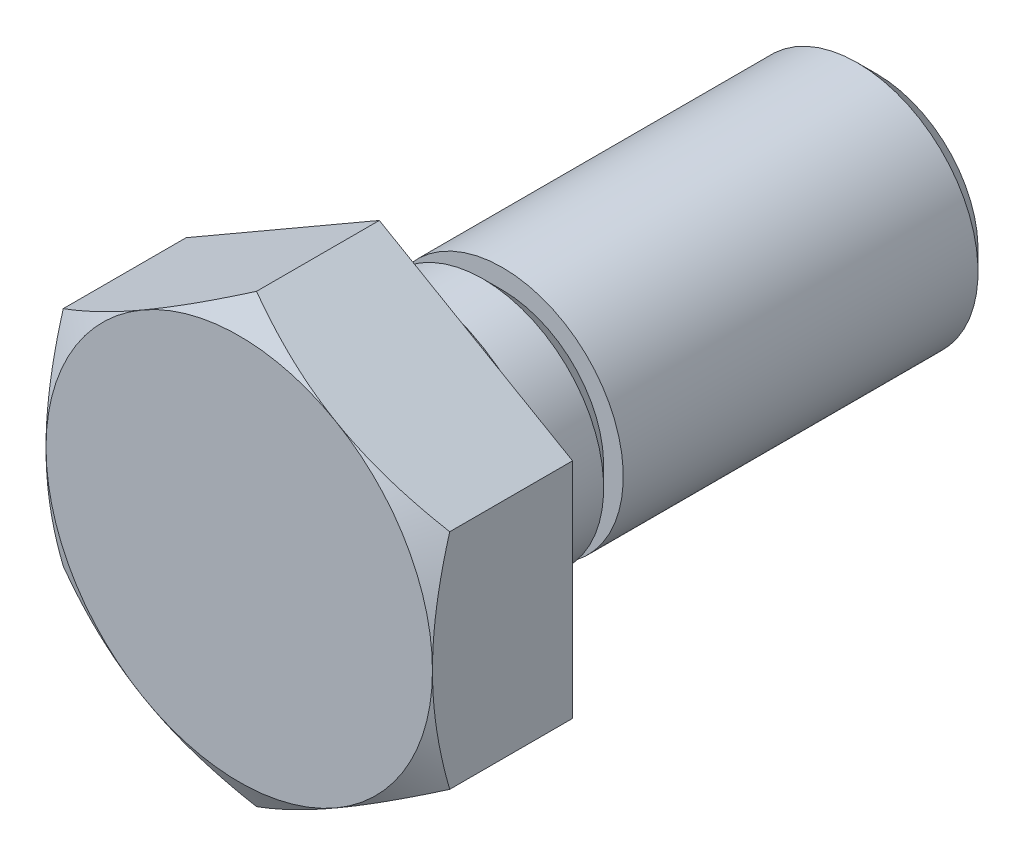
ISO-10303-21;
HEADER;
FILE_DESCRIPTION(('STEP AP214'),'2;1');
FILE_NAME('part.step','',(''),(''),'','','');
FILE_SCHEMA(('AUTOMOTIVE_DESIGN { 1 0 10303 214 1 1 1 1 }'));
ENDSEC;
DATA;
#1=APPLICATION_CONTEXT('core data for automotive mechanical design processes');
#2=APPLICATION_PROTOCOL_DEFINITION('international standard','automotive_design',2000,#1);
#3=PRODUCT_CONTEXT('',#1,'mechanical');
#4=PRODUCT('Part','Part','',(#3));
#5=PRODUCT_RELATED_PRODUCT_CATEGORY('part','',(#4));
#6=PRODUCT_DEFINITION_FORMATION('','',#4);
#7=PRODUCT_DEFINITION_CONTEXT('part definition',#1,'design');
#8=PRODUCT_DEFINITION('design','',#6,#7);
#9=PRODUCT_DEFINITION_SHAPE('','',#8);
#10=(LENGTH_UNIT() NAMED_UNIT(*) SI_UNIT(.MILLI.,.METRE.));
#11=(NAMED_UNIT(*) PLANE_ANGLE_UNIT() SI_UNIT($,.RADIAN.));
#12=(NAMED_UNIT(*) SI_UNIT($,.STERADIAN.) SOLID_ANGLE_UNIT());
#13=UNCERTAINTY_MEASURE_WITH_UNIT(LENGTH_MEASURE(1.E-05),#10,'distance_accuracy_value','');
#14=(GEOMETRIC_REPRESENTATION_CONTEXT(3) GLOBAL_UNCERTAINTY_ASSIGNED_CONTEXT((#13)) GLOBAL_UNIT_ASSIGNED_CONTEXT((#10,
#11,#12)) REPRESENTATION_CONTEXT('',''));
#15=CARTESIAN_POINT('',(0.,0.,0.));
#16=DIRECTION('',(0.,0.,1.));
#17=DIRECTION('',(1.,0.,0.));
#18=AXIS2_PLACEMENT_3D('',#15,#16,#17);
#19=CARTESIAN_POINT('',(0.,4.,6.4));
#20=DIRECTION('',(0.,0.,1.));
#21=DIRECTION('',(0.,-1.,0.));
#22=AXIS2_PLACEMENT_3D('',#19,#20,#21);
#23=PLANE('',#22);
#24=CARTESIAN_POINT('',(0.,0.,6.4));
#25=DIRECTION('',(0.,0.,-1.));
#26=DIRECTION('',(0.,1.,0.));
#27=AXIS2_PLACEMENT_3D('',#24,#25,#26);
#28=CIRCLE('',#27,8.);
#29=CARTESIAN_POINT('',(-4.,6.92820323027551,6.4));
#30=VERTEX_POINT('',#29);
#31=CARTESIAN_POINT('',(4.,6.92820323027551,6.4));
#32=VERTEX_POINT('',#31);
#33=EDGE_CURVE('E153',#30,#32,#28,.T.);
#34=ORIENTED_EDGE('',*,*,#33,.F.);
#35=CARTESIAN_POINT('',(0.,0.,6.4));
#36=DIRECTION('',(0.,0.,-1.));
#37=DIRECTION('',(0.,1.,0.));
#38=AXIS2_PLACEMENT_3D('',#35,#36,#37);
#39=CIRCLE('',#38,8.);
#40=CARTESIAN_POINT('',(-8.,0.,6.4));
#41=VERTEX_POINT('',#40);
#42=EDGE_CURVE('E172',#41,#30,#39,.T.);
#43=ORIENTED_EDGE('',*,*,#42,.F.);
#44=CARTESIAN_POINT('',(0.,0.,6.4));
#45=DIRECTION('',(0.,0.,-1.));
#46=DIRECTION('',(0.,1.,0.));
#47=AXIS2_PLACEMENT_3D('',#44,#45,#46);
#48=CIRCLE('',#47,8.);
#49=CARTESIAN_POINT('',(-4.,-6.92820323027551,6.4));
#50=VERTEX_POINT('',#49);
#51=EDGE_CURVE('E221',#50,#41,#48,.T.);
#52=ORIENTED_EDGE('',*,*,#51,.F.);
#53=CARTESIAN_POINT('',(0.,0.,6.4));
#54=DIRECTION('',(0.,0.,-1.));
#55=DIRECTION('',(0.,1.,0.));
#56=AXIS2_PLACEMENT_3D('',#53,#54,#55);
#57=CIRCLE('',#56,8.);
#58=CARTESIAN_POINT('',(4.,-6.92820323027551,6.4));
#59=VERTEX_POINT('',#58);
#60=EDGE_CURVE('E274',#59,#50,#57,.T.);
#61=ORIENTED_EDGE('',*,*,#60,.F.);
#62=CARTESIAN_POINT('',(0.,0.,6.4));
#63=DIRECTION('',(0.,0.,-1.));
#64=DIRECTION('',(0.,1.,0.));
#65=AXIS2_PLACEMENT_3D('',#62,#63,#64);
#66=CIRCLE('',#65,8.);
#67=CARTESIAN_POINT('',(8.,0.,6.4));
#68=VERTEX_POINT('',#67);
#69=EDGE_CURVE('E272',#68,#59,#66,.T.);
#70=ORIENTED_EDGE('',*,*,#69,.F.);
#71=CARTESIAN_POINT('',(0.,0.,6.4));
#72=DIRECTION('',(0.,0.,-1.));
#73=DIRECTION('',(0.,1.,0.));
#74=AXIS2_PLACEMENT_3D('',#71,#72,#73);
#75=CIRCLE('',#74,8.);
#76=EDGE_CURVE('E222',#32,#68,#75,.T.);
#77=ORIENTED_EDGE('',*,*,#76,.F.);
#78=EDGE_LOOP('',(#34,#43,#52,#61,#70,#77));
#79=FACE_BOUND('',#78,.T.);
#80=ADVANCED_FACE('F16',(#79),#23,.T.);
#81=CARTESIAN_POINT('',(0.,2.0940625,-20.));
#82=DIRECTION('',(0.,0.,-1.));
#83=DIRECTION('',(0.,1.,0.));
#84=AXIS2_PLACEMENT_3D('',#81,#82,#83);
#85=PLANE('',#84);
#86=CARTESIAN_POINT('',(0.,0.,-20.));
#87=DIRECTION('',(0.,0.,-1.));
#88=DIRECTION('',(0.,1.,0.));
#89=AXIS2_PLACEMENT_3D('',#86,#87,#88);
#90=CIRCLE('',#89,4.188125);
#91=CARTESIAN_POINT('',(0.,4.188125,-20.));
#92=VERTEX_POINT('',#91);
#93=EDGE_CURVE('E11',#92,#92,#90,.T.);
#94=ORIENTED_EDGE('',*,*,#93,.T.);
#95=EDGE_LOOP('',(#94));
#96=FACE_BOUND('',#95,.T.);
#97=ADVANCED_FACE('F381',(#96),#85,.T.);
#98=CARTESIAN_POINT('',(0.,0.,-19.5940625));
#99=DIRECTION('',(0.,0.,1.));
#100=DIRECTION('',(0.,1.,0.));
#101=AXIS2_PLACEMENT_3D('',#98,#99,#100);
#102=CONICAL_SURFACE('',#101,4.5940625,0.785398163397448);
#103=CARTESIAN_POINT('',(0.,0.,-19.188125));
#104=DIRECTION('',(0.,0.,-1.));
#105=DIRECTION('',(0.,1.,0.));
#106=AXIS2_PLACEMENT_3D('',#103,#104,#105);
#107=CIRCLE('',#106,5.);
#108=CARTESIAN_POINT('',(0.,5.,-19.188125));
#109=VERTEX_POINT('',#108);
#110=EDGE_CURVE('E28',#109,#109,#107,.T.);
#111=ORIENTED_EDGE('',*,*,#110,.T.);
#112=EDGE_LOOP('',(#111));
#113=FACE_BOUND('',#112,.T.);
#114=ORIENTED_EDGE('',*,*,#93,.F.);
#115=EDGE_LOOP('',(#114));
#116=FACE_BOUND('',#115,.T.);
#117=ADVANCED_FACE('F18',(#113,#116),#102,.T.);
#118=CARTESIAN_POINT('',(0.,0.,-11.8440625));
#119=DIRECTION('',(0.,0.,1.));
#120=DIRECTION('',(0.,1.,0.));
#121=AXIS2_PLACEMENT_3D('',#118,#119,#120);
#122=CYLINDRICAL_SURFACE('',#121,5.);
#123=CARTESIAN_POINT('',(0.,0.,-4.5));
#124=DIRECTION('',(0.,0.,-1.));
#125=DIRECTION('',(0.,1.,0.));
#126=AXIS2_PLACEMENT_3D('',#123,#124,#125);
#127=CIRCLE('',#126,5.);
#128=CARTESIAN_POINT('',(0.,5.,-4.5));
#129=VERTEX_POINT('',#128);
#130=EDGE_CURVE('E171',#129,#129,#127,.T.);
#131=ORIENTED_EDGE('',*,*,#130,.T.);
#132=EDGE_LOOP('',(#131));
#133=FACE_BOUND('',#132,.T.);
#134=ORIENTED_EDGE('',*,*,#110,.F.);
#135=EDGE_LOOP('',(#134));
#136=FACE_BOUND('',#135,.T.);
#137=ADVANCED_FACE('F368',(#133,#136),#122,.T.);
#138=CARTESIAN_POINT('',(0.,4.5940625,-4.5));
#139=DIRECTION('',(0.,0.,1.));
#140=DIRECTION('',(0.,-1.,0.));
#141=AXIS2_PLACEMENT_3D('',#138,#139,#140);
#142=PLANE('',#141);
#143=CARTESIAN_POINT('',(0.,0.,-4.5));
#144=DIRECTION('',(0.,0.,-1.));
#145=DIRECTION('',(0.,1.,0.));
#146=AXIS2_PLACEMENT_3D('',#143,#144,#145);
#147=CIRCLE('',#146,4.188125);
#148=CARTESIAN_POINT('',(0.,4.188125,-4.5));
#149=VERTEX_POINT('',#148);
#150=EDGE_CURVE('E147',#149,#149,#147,.T.);
#151=ORIENTED_EDGE('',*,*,#150,.T.);
#152=EDGE_LOOP('',(#151));
#153=FACE_BOUND('',#152,.T.);
#154=ORIENTED_EDGE('',*,*,#130,.F.);
#155=EDGE_LOOP('',(#154));
#156=FACE_BOUND('',#155,.T.);
#157=ADVANCED_FACE('F370',(#153,#156),#142,.T.);
#158=CARTESIAN_POINT('',(0.,0.,-4.0940625));
#159=DIRECTION('',(0.,0.,1.));
#160=DIRECTION('',(0.,1.,0.));
#161=AXIS2_PLACEMENT_3D('',#158,#159,#160);
#162=CONICAL_SURFACE('',#161,4.5940625,0.785398163397449);
#163=CARTESIAN_POINT('',(0.,0.,-3.688125));
#164=DIRECTION('',(0.,0.,-1.));
#165=DIRECTION('',(0.,1.,0.));
#166=AXIS2_PLACEMENT_3D('',#163,#164,#165);
#167=CIRCLE('',#166,5.);
#168=CARTESIAN_POINT('',(0.,5.,-3.688125));
#169=VERTEX_POINT('',#168);
#170=EDGE_CURVE('E145',#169,#169,#167,.T.);
#171=ORIENTED_EDGE('',*,*,#170,.T.);
#172=EDGE_LOOP('',(#171));
#173=FACE_BOUND('',#172,.T.);
#174=ORIENTED_EDGE('',*,*,#150,.F.);
#175=EDGE_LOOP('',(#174));
#176=FACE_BOUND('',#175,.T.);
#177=ADVANCED_FACE('F378',(#173,#176),#162,.T.);
#178=CARTESIAN_POINT('',(0.,0.,-2.0440625));
#179=DIRECTION('',(0.,0.,1.));
#180=DIRECTION('',(0.,1.,0.));
#181=AXIS2_PLACEMENT_3D('',#178,#179,#180);
#182=CYLINDRICAL_SURFACE('',#181,5.);
#183=CARTESIAN_POINT('',(0.,0.,-0.4));
#184=DIRECTION('',(0.,0.,-1.));
#185=DIRECTION('',(0.,1.,0.));
#186=AXIS2_PLACEMENT_3D('',#183,#184,#185);
#187=CIRCLE('',#186,5.);
#188=CARTESIAN_POINT('',(0.,5.,-0.4));
#189=VERTEX_POINT('',#188);
#190=EDGE_CURVE('E141',#189,#189,#187,.T.);
#191=ORIENTED_EDGE('',*,*,#190,.T.);
#192=EDGE_LOOP('',(#191));
#193=FACE_BOUND('',#192,.T.);
#194=ORIENTED_EDGE('',*,*,#170,.F.);
#195=EDGE_LOOP('',(#194));
#196=FACE_BOUND('',#195,.T.);
#197=ADVANCED_FACE('F142',(#193,#196),#182,.T.);
#198=CARTESIAN_POINT('',(0.,0.,-0.4));
#199=DIRECTION('',(0.,0.,-1.));
#200=DIRECTION('',(-1.,0.,0.));
#201=AXIS2_PLACEMENT_3D('',#198,#199,#200);
#202=TOROIDAL_SURFACE('',#201,5.4,0.4);
#203=CARTESIAN_POINT('',(0.,0.,0.));
#204=DIRECTION('',(0.,0.,-1.));
#205=DIRECTION('',(0.,1.,0.));
#206=AXIS2_PLACEMENT_3D('',#203,#204,#205);
#207=CIRCLE('',#206,5.4);
#208=CARTESIAN_POINT('',(0.,5.4,0.));
#209=VERTEX_POINT('',#208);
#210=EDGE_CURVE('E137',#209,#209,#207,.T.);
#211=ORIENTED_EDGE('',*,*,#210,.T.);
#212=EDGE_LOOP('',(#211));
#213=FACE_BOUND('',#212,.T.);
#214=ORIENTED_EDGE('',*,*,#190,.F.);
#215=EDGE_LOOP('',(#214));
#216=FACE_BOUND('',#215,.T.);
#217=ADVANCED_FACE('F405',(#213,#216),#202,.F.);
#218=CARTESIAN_POINT('',(0.,6.3075,0.));
#219=DIRECTION('',(0.,0.,-1.));
#220=DIRECTION('',(0.,1.,0.));
#221=AXIS2_PLACEMENT_3D('',#218,#219,#220);
#222=PLANE('',#221);
#223=CARTESIAN_POINT('',(0.,0.,0.));
#224=DIRECTION('',(0.,0.,-1.));
#225=DIRECTION('',(0.,1.,0.));
#226=AXIS2_PLACEMENT_3D('',#223,#224,#225);
#227=CIRCLE('',#226,7.215);
#228=CARTESIAN_POINT('',(0.,7.215,0.));
#229=VERTEX_POINT('',#228);
#230=EDGE_CURVE('E149',#229,#229,#227,.T.);
#231=ORIENTED_EDGE('',*,*,#230,.T.);
#232=EDGE_LOOP('',(#231));
#233=FACE_BOUND('',#232,.T.);
#234=ORIENTED_EDGE('',*,*,#210,.F.);
#235=EDGE_LOOP('',(#234));
#236=FACE_BOUND('',#235,.T.);
#237=ADVANCED_FACE('F401',(#233,#236),#222,.T.);
#238=CARTESIAN_POINT('',(0.,0.,0.1));
#239=DIRECTION('',(0.,0.,-1.));
#240=DIRECTION('',(-1.,0.,0.));
#241=AXIS2_PLACEMENT_3D('',#238,#239,#240);
#242=TOROIDAL_SURFACE('',#241,7.215,0.1);
#243=CARTESIAN_POINT('',(0.,0.,0.1));
#244=DIRECTION('',(0.,0.,-1.));
#245=DIRECTION('',(0.,1.,0.));
#246=AXIS2_PLACEMENT_3D('',#243,#244,#245);
#247=CIRCLE('',#246,7.315);
#248=CARTESIAN_POINT('',(0.,7.315,0.1));
#249=VERTEX_POINT('',#248);
#250=EDGE_CURVE('E354',#249,#249,#247,.T.);
#251=ORIENTED_EDGE('',*,*,#250,.T.);
#252=EDGE_LOOP('',(#251));
#253=FACE_BOUND('',#252,.T.);
#254=ORIENTED_EDGE('',*,*,#230,.F.);
#255=EDGE_LOOP('',(#254));
#256=FACE_BOUND('',#255,.T.);
#257=ADVANCED_FACE('F404',(#253,#256),#242,.T.);
#258=CARTESIAN_POINT('',(0.,0.,0.2));
#259=DIRECTION('',(0.,0.,1.));
#260=DIRECTION('',(0.,1.,0.));
#261=AXIS2_PLACEMENT_3D('',#258,#259,#260);
#262=CYLINDRICAL_SURFACE('',#261,7.315);
#263=CARTESIAN_POINT('',(0.,0.,0.3));
#264=DIRECTION('',(0.,0.,-1.));
#265=DIRECTION('',(0.,1.,0.));
#266=AXIS2_PLACEMENT_3D('',#263,#264,#265);
#267=CIRCLE('',#266,7.315);
#268=CARTESIAN_POINT('',(0.,7.315,0.3));
#269=VERTEX_POINT('',#268);
#270=EDGE_CURVE('E236',#269,#269,#267,.T.);
#271=ORIENTED_EDGE('',*,*,#270,.T.);
#272=EDGE_LOOP('',(#271));
#273=FACE_BOUND('',#272,.T.);
#274=ORIENTED_EDGE('',*,*,#250,.F.);
#275=EDGE_LOOP('',(#274));
#276=FACE_BOUND('',#275,.T.);
#277=ADVANCED_FACE('F424',(#273,#276),#262,.T.);
#278=CARTESIAN_POINT('',(0.,0.,0.3));
#279=DIRECTION('',(0.,0.,-1.));
#280=DIRECTION('',(-1.,0.,0.));
#281=AXIS2_PLACEMENT_3D('',#278,#279,#280);
#282=TOROIDAL_SURFACE('',#281,7.615,0.3);
#283=CARTESIAN_POINT('',(0.,0.,0.6));
#284=DIRECTION('',(0.,0.,-1.));
#285=DIRECTION('',(0.,1.,0.));
#286=AXIS2_PLACEMENT_3D('',#283,#284,#285);
#287=CIRCLE('',#286,7.615);
#288=CARTESIAN_POINT('',(0.,7.615,0.6));
#289=VERTEX_POINT('',#288);
#290=EDGE_CURVE('E233',#289,#289,#287,.T.);
#291=ORIENTED_EDGE('',*,*,#290,.T.);
#292=EDGE_LOOP('',(#291));
#293=FACE_BOUND('',#292,.T.);
#294=ORIENTED_EDGE('',*,*,#270,.F.);
#295=EDGE_LOOP('',(#294));
#296=FACE_BOUND('',#295,.T.);
#297=ADVANCED_FACE('F426',(#293,#296),#282,.F.);
#298=CARTESIAN_POINT('',(0.,8.4263,0.6));
#299=DIRECTION('',(0.,0.,-1.));
#300=DIRECTION('',(0.,1.,0.));
#301=AXIS2_PLACEMENT_3D('',#298,#299,#300);
#302=PLANE('',#301);
#303=ORIENTED_EDGE('',*,*,#290,.F.);
#304=EDGE_LOOP('',(#303));
#305=FACE_BOUND('',#304,.T.);
#306=DIRECTION('',(0.866025403784439,0.5,0.));
#307=VECTOR('',#306,1.);
#308=CARTESIAN_POINT('',(5.82434746497721,-5.87491573027551,0.6));
#309=LINE('',#308,#307);
#310=CARTESIAN_POINT('',(7.46000695697177E-06,-9.23759999999699,0.6));
#311=VERTEX_POINT('',#310);
#312=CARTESIAN_POINT('',(7.99999253999304,-4.61880646055403,0.6));
#313=VERTEX_POINT('',#312);
#314=EDGE_CURVE('E270',#311,#313,#309,.T.);
#315=ORIENTED_EDGE('',*,*,#314,.F.);
#316=CARTESIAN_POINT('',(0.,0.,0.6));
#317=DIRECTION('',(0.,0.,-1.));
#318=DIRECTION('',(0.,1.,0.));
#319=AXIS2_PLACEMENT_3D('',#316,#317,#318);
#320=CIRCLE('',#319,9.2376);
#321=CARTESIAN_POINT('',(-7.46000695315288E-06,-9.23759999999699,0.6));
#322=VERTEX_POINT('',#321);
#323=EDGE_CURVE('E237',#311,#322,#320,.T.);
#324=ORIENTED_EDGE('',*,*,#323,.T.);
#325=DIRECTION('',(0.866025403784439,-0.5,0.));
#326=VECTOR('',#325,1.);
#327=CARTESIAN_POINT('',(-5.8243474649772,-5.87491573027551,0.6));
#328=LINE('',#327,#326);
#329=CARTESIAN_POINT('',(-7.99999253999304,-4.61880646055403,0.6));
#330=VERTEX_POINT('',#329);
#331=EDGE_CURVE('E186',#330,#322,#328,.T.);
#332=ORIENTED_EDGE('',*,*,#331,.F.);
#333=CARTESIAN_POINT('',(0.,0.,0.6));
#334=DIRECTION('',(0.,0.,-1.));
#335=DIRECTION('',(0.,1.,0.));
#336=AXIS2_PLACEMENT_3D('',#333,#334,#335);
#337=CIRCLE('',#336,9.2376);
#338=CARTESIAN_POINT('',(-8.,-4.61879353944296,0.6));
#339=VERTEX_POINT('',#338);
#340=EDGE_CURVE('E242',#330,#339,#337,.T.);
#341=ORIENTED_EDGE('',*,*,#340,.T.);
#342=DIRECTION('',(0.,-1.,0.));
#343=VECTOR('',#342,1.);
#344=CARTESIAN_POINT('',(-8.,4.21315,0.6));
#345=LINE('',#344,#343);
#346=CARTESIAN_POINT('',(-8.,4.61879353944296,0.6));
#347=VERTEX_POINT('',#346);
#348=EDGE_CURVE('E247',#347,#339,#345,.T.);
#349=ORIENTED_EDGE('',*,*,#348,.F.);
#350=CARTESIAN_POINT('',(0.,0.,0.6));
#351=DIRECTION('',(0.,0.,-1.));
#352=DIRECTION('',(0.,1.,0.));
#353=AXIS2_PLACEMENT_3D('',#350,#351,#352);
#354=CIRCLE('',#353,9.2376);
#355=CARTESIAN_POINT('',(-7.99999253999305,4.61880646055402,0.6));
#356=VERTEX_POINT('',#355);
#357=EDGE_CURVE('E155',#347,#356,#354,.T.);
#358=ORIENTED_EDGE('',*,*,#357,.T.);
#359=DIRECTION('',(-0.866025403784439,-0.5,0.));
#360=VECTOR('',#359,1.);
#361=CARTESIAN_POINT('',(-2.1756525350228,7.98149073027551,0.6));
#362=LINE('',#361,#360);
#363=CARTESIAN_POINT('',(-7.46000695714968E-06,9.23759999999699,0.6));
#364=VERTEX_POINT('',#363);
#365=EDGE_CURVE('E176',#364,#356,#362,.T.);
#366=ORIENTED_EDGE('',*,*,#365,.F.);
#367=CARTESIAN_POINT('',(0.,0.,0.6));
#368=DIRECTION('',(0.,0.,-1.));
#369=DIRECTION('',(0.,1.,0.));
#370=AXIS2_PLACEMENT_3D('',#367,#368,#369);
#371=CIRCLE('',#370,9.2376);
#372=CARTESIAN_POINT('',(7.4600069516427E-06,9.23759999999699,0.6));
#373=VERTEX_POINT('',#372);
#374=EDGE_CURVE('E158',#364,#373,#371,.T.);
#375=ORIENTED_EDGE('',*,*,#374,.T.);
#376=DIRECTION('',(-0.866025403784439,0.5,0.));
#377=VECTOR('',#376,1.);
#378=CARTESIAN_POINT('',(2.1756525350228,7.98149073027551,0.6));
#379=LINE('',#378,#377);
#380=CARTESIAN_POINT('',(7.99999253999304,4.61880646055404,0.6));
#381=VERTEX_POINT('',#380);
#382=EDGE_CURVE('E187',#381,#373,#379,.T.);
#383=ORIENTED_EDGE('',*,*,#382,.F.);
#384=CARTESIAN_POINT('',(0.,0.,0.6));
#385=DIRECTION('',(0.,0.,-1.));
#386=DIRECTION('',(0.,1.,0.));
#387=AXIS2_PLACEMENT_3D('',#384,#385,#386);
#388=CIRCLE('',#387,9.2376);
#389=CARTESIAN_POINT('',(8.,4.61879353944296,0.6));
#390=VERTEX_POINT('',#389);
#391=EDGE_CURVE('E157',#381,#390,#388,.T.);
#392=ORIENTED_EDGE('',*,*,#391,.T.);
#393=DIRECTION('',(0.,1.,0.));
#394=VECTOR('',#393,1.);
#395=CARTESIAN_POINT('',(8.,4.21315,0.6));
#396=LINE('',#395,#394);
#397=CARTESIAN_POINT('',(8.,-4.61879353944296,0.6));
#398=VERTEX_POINT('',#397);
#399=EDGE_CURVE('E204',#398,#390,#396,.T.);
#400=ORIENTED_EDGE('',*,*,#399,.F.);
#401=CARTESIAN_POINT('',(0.,0.,0.6));
#402=DIRECTION('',(0.,0.,-1.));
#403=DIRECTION('',(0.,1.,0.));
#404=AXIS2_PLACEMENT_3D('',#401,#402,#403);
#405=CIRCLE('',#404,9.2376);
#406=EDGE_CURVE('E240',#398,#313,#405,.T.);
#407=ORIENTED_EDGE('',*,*,#406,.T.);
#408=EDGE_LOOP('',(#315,#324,#332,#341,#349,#358,#366,#375,#383,#392,#400,#407));
#409=FACE_BOUND('',#408,.T.);
#410=ADVANCED_FACE('F330',(#305,#409),#302,.T.);
#411=CARTESIAN_POINT('',(0.,0.,3.14273565342546));
#412=DIRECTION('',(0.,0.,1.));
#413=DIRECTION('',(0.,1.,0.));
#414=AXIS2_PLACEMENT_3D('',#411,#412,#413);
#415=CYLINDRICAL_SURFACE('',#414,9.2376);
#416=DIRECTION('',(0.,0.,-1.));
#417=VECTOR('',#416,1.);
#418=CARTESIAN_POINT('',(7.46000695681608E-06,-9.23759999999699,3.14273565342546));
#419=LINE('',#418,#417);
#420=CARTESIAN_POINT('',(7.46000695666039E-06,-9.23759999999699,5.68547130685092));
#421=VERTEX_POINT('',#420);
#422=EDGE_CURVE('E258',#421,#311,#419,.T.);
#423=ORIENTED_EDGE('',*,*,#422,.F.);
#424=CARTESIAN_POINT('',(0.,0.,5.68547130685092));
#425=DIRECTION('',(0.,0.,-1.));
#426=DIRECTION('',(0.,1.,0.));
#427=AXIS2_PLACEMENT_3D('',#424,#425,#426);
#428=CIRCLE('',#427,9.2376);
#429=CARTESIAN_POINT('',(-7.46000695346426E-06,-9.23759999999699,5.68547130685092));
#430=VERTEX_POINT('',#429);
#431=EDGE_CURVE('E239',#421,#430,#428,.T.);
#432=ORIENTED_EDGE('',*,*,#431,.T.);
#433=DIRECTION('',(0.,0.,1.));
#434=VECTOR('',#433,1.);
#435=CARTESIAN_POINT('',(-7.46000695330857E-06,-9.23759999999699,3.14273565342546));
#436=LINE('',#435,#434);
#437=EDGE_CURVE('E183',#322,#430,#436,.T.);
#438=ORIENTED_EDGE('',*,*,#437,.F.);
#439=ORIENTED_EDGE('',*,*,#323,.F.);
#440=EDGE_LOOP('',(#423,#432,#438,#439));
#441=FACE_BOUND('',#440,.T.);
#442=ADVANCED_FACE('F498',(#441),#415,.T.);
#443=CARTESIAN_POINT('',(0.,0.,3.14273565342546));
#444=DIRECTION('',(0.,0.,1.));
#445=DIRECTION('',(0.,1.,0.));
#446=AXIS2_PLACEMENT_3D('',#443,#444,#445);
#447=CYLINDRICAL_SURFACE('',#446,9.2376);
#448=DIRECTION('',(0.,0.,1.));
#449=VECTOR('',#448,1.);
#450=CARTESIAN_POINT('',(7.99999253999304,-4.61880646055403,3.14273565342546));
#451=LINE('',#450,#449);
#452=CARTESIAN_POINT('',(7.99999253999304,-4.61880646055403,5.68547130685092));
#453=VERTEX_POINT('',#452);
#454=EDGE_CURVE('E228',#313,#453,#451,.T.);
#455=ORIENTED_EDGE('',*,*,#454,.F.);
#456=ORIENTED_EDGE('',*,*,#406,.F.);
#457=DIRECTION('',(0.,0.,-1.));
#458=VECTOR('',#457,1.);
#459=CARTESIAN_POINT('',(8.,-4.61879353944296,3.14273565342546));
#460=LINE('',#459,#458);
#461=CARTESIAN_POINT('',(8.,-4.61879353944296,5.68547130685092));
#462=VERTEX_POINT('',#461);
#463=EDGE_CURVE('E208',#462,#398,#460,.T.);
#464=ORIENTED_EDGE('',*,*,#463,.F.);
#465=CARTESIAN_POINT('',(0.,0.,5.68547130685092));
#466=DIRECTION('',(0.,0.,-1.));
#467=DIRECTION('',(0.,1.,0.));
#468=AXIS2_PLACEMENT_3D('',#465,#466,#467);
#469=CIRCLE('',#468,9.2376);
#470=EDGE_CURVE('E275',#462,#453,#469,.T.);
#471=ORIENTED_EDGE('',*,*,#470,.T.);
#472=EDGE_LOOP('',(#455,#456,#464,#471));
#473=FACE_BOUND('',#472,.T.);
#474=ADVANCED_FACE('F472',(#473),#447,.T.);
#475=CARTESIAN_POINT('',(0.,0.,3.14273565342546));
#476=DIRECTION('',(0.,0.,1.));
#477=DIRECTION('',(0.,1.,0.));
#478=AXIS2_PLACEMENT_3D('',#475,#476,#477);
#479=CYLINDRICAL_SURFACE('',#478,9.2376);
#480=DIRECTION('',(0.,0.,1.));
#481=VECTOR('',#480,1.);
#482=CARTESIAN_POINT('',(-8.,-4.61879353944296,3.14273565342546));
#483=LINE('',#482,#481);
#484=CARTESIAN_POINT('',(-8.,-4.61879353944296,5.68547130685092));
#485=VERTEX_POINT('',#484);
#486=EDGE_CURVE('E215',#339,#485,#483,.T.);
#487=ORIENTED_EDGE('',*,*,#486,.F.);
#488=ORIENTED_EDGE('',*,*,#340,.F.);
#489=DIRECTION('',(0.,0.,-1.));
#490=VECTOR('',#489,1.);
#491=CARTESIAN_POINT('',(-7.99999253999304,-4.61880646055403,3.14273565342546));
#492=LINE('',#491,#490);
#493=CARTESIAN_POINT('',(-7.99999253999304,-4.61880646055403,5.68547130685092));
#494=VERTEX_POINT('',#493);
#495=EDGE_CURVE('E253',#494,#330,#492,.T.);
#496=ORIENTED_EDGE('',*,*,#495,.F.);
#497=CARTESIAN_POINT('',(0.,0.,5.68547130685092));
#498=DIRECTION('',(0.,0.,-1.));
#499=DIRECTION('',(0.,1.,0.));
#500=AXIS2_PLACEMENT_3D('',#497,#498,#499);
#501=CIRCLE('',#500,9.2376);
#502=EDGE_CURVE('E216',#494,#485,#501,.T.);
#503=ORIENTED_EDGE('',*,*,#502,.T.);
#504=EDGE_LOOP('',(#487,#488,#496,#503));
#505=FACE_BOUND('',#504,.T.);
#506=ADVANCED_FACE('F464',(#505),#479,.T.);
#507=CARTESIAN_POINT('',(0.,0.,3.14273565342546));
#508=DIRECTION('',(0.,0.,1.));
#509=DIRECTION('',(0.,1.,0.));
#510=AXIS2_PLACEMENT_3D('',#507,#508,#509);
#511=CYLINDRICAL_SURFACE('',#510,9.2376);
#512=DIRECTION('',(0.,0.,1.));
#513=VECTOR('',#512,1.);
#514=CARTESIAN_POINT('',(8.,4.61879353944296,3.14273565342546));
#515=LINE('',#514,#513);
#516=CARTESIAN_POINT('',(8.,4.61879353944296,5.68547130685092));
#517=VERTEX_POINT('',#516);
#518=EDGE_CURVE('E207',#390,#517,#515,.T.);
#519=ORIENTED_EDGE('',*,*,#518,.F.);
#520=ORIENTED_EDGE('',*,*,#391,.F.);
#521=DIRECTION('',(0.,0.,-1.));
#522=VECTOR('',#521,1.);
#523=CARTESIAN_POINT('',(7.99999253999304,4.61880646055404,3.14273565342546));
#524=LINE('',#523,#522);
#525=CARTESIAN_POINT('',(7.99999253999304,4.61880646055404,5.68547130685092));
#526=VERTEX_POINT('',#525);
#527=EDGE_CURVE('E191',#526,#381,#524,.T.);
#528=ORIENTED_EDGE('',*,*,#527,.F.);
#529=CARTESIAN_POINT('',(0.,0.,5.68547130685092));
#530=DIRECTION('',(0.,0.,-1.));
#531=DIRECTION('',(0.,1.,0.));
#532=AXIS2_PLACEMENT_3D('',#529,#530,#531);
#533=CIRCLE('',#532,9.2376);
#534=EDGE_CURVE('E174',#526,#517,#533,.T.);
#535=ORIENTED_EDGE('',*,*,#534,.T.);
#536=EDGE_LOOP('',(#519,#520,#528,#535));
#537=FACE_BOUND('',#536,.T.);
#538=ADVANCED_FACE('F419',(#537),#511,.T.);
#539=CARTESIAN_POINT('',(0.,0.,3.14273565342546));
#540=DIRECTION('',(0.,0.,1.));
#541=DIRECTION('',(0.,1.,0.));
#542=AXIS2_PLACEMENT_3D('',#539,#540,#541);
#543=CYLINDRICAL_SURFACE('',#542,9.2376);
#544=DIRECTION('',(0.,0.,1.));
#545=VECTOR('',#544,1.);
#546=CARTESIAN_POINT('',(-7.99999253999305,4.61880646055402,3.14273565342546));
#547=LINE('',#546,#545);
#548=CARTESIAN_POINT('',(-7.99999253999305,4.61880646055402,5.68547130685092));
#549=VERTEX_POINT('',#548);
#550=EDGE_CURVE('E178',#356,#549,#547,.T.);
#551=ORIENTED_EDGE('',*,*,#550,.F.);
#552=ORIENTED_EDGE('',*,*,#357,.F.);
#553=DIRECTION('',(0.,0.,-1.));
#554=VECTOR('',#553,1.);
#555=CARTESIAN_POINT('',(-8.,4.61879353944296,3.14273565342546));
#556=LINE('',#555,#554);
#557=CARTESIAN_POINT('',(-8.,4.61879353944296,5.68547130685092));
#558=VERTEX_POINT('',#557);
#559=EDGE_CURVE('E164',#558,#347,#556,.T.);
#560=ORIENTED_EDGE('',*,*,#559,.F.);
#561=CARTESIAN_POINT('',(0.,0.,5.68547130685092));
#562=DIRECTION('',(0.,0.,-1.));
#563=DIRECTION('',(0.,1.,0.));
#564=AXIS2_PLACEMENT_3D('',#561,#562,#563);
#565=CIRCLE('',#564,9.2376);
#566=EDGE_CURVE('E175',#558,#549,#565,.T.);
#567=ORIENTED_EDGE('',*,*,#566,.T.);
#568=EDGE_LOOP('',(#551,#552,#560,#567));
#569=FACE_BOUND('',#568,.T.);
#570=ADVANCED_FACE('F416',(#569),#543,.T.);
#571=CARTESIAN_POINT('',(0.,0.,3.14273565342546));
#572=DIRECTION('',(0.,0.,1.));
#573=DIRECTION('',(0.,1.,0.));
#574=AXIS2_PLACEMENT_3D('',#571,#572,#573);
#575=CYLINDRICAL_SURFACE('',#574,9.2376);
#576=DIRECTION('',(0.,0.,1.));
#577=VECTOR('',#576,1.);
#578=CARTESIAN_POINT('',(7.46000695148701E-06,9.23759999999699,3.14273565342546));
#579=LINE('',#578,#577);
#580=CARTESIAN_POINT('',(7.46000695133132E-06,9.23759999999699,5.68547130685092));
#581=VERTEX_POINT('',#580);
#582=EDGE_CURVE('E190',#373,#581,#579,.T.);
#583=ORIENTED_EDGE('',*,*,#582,.F.);
#584=ORIENTED_EDGE('',*,*,#374,.F.);
#585=DIRECTION('',(0.,0.,-1.));
#586=VECTOR('',#585,1.);
#587=CARTESIAN_POINT('',(-7.46000695730537E-06,9.23759999999699,3.14273565342546));
#588=LINE('',#587,#586);
#589=CARTESIAN_POINT('',(-7.46000695746107E-06,9.23759999999699,5.68547130685092));
#590=VERTEX_POINT('',#589);
#591=EDGE_CURVE('E179',#590,#364,#588,.T.);
#592=ORIENTED_EDGE('',*,*,#591,.F.);
#593=CARTESIAN_POINT('',(0.,0.,5.68547130685092));
#594=DIRECTION('',(0.,0.,-1.));
#595=DIRECTION('',(0.,1.,0.));
#596=AXIS2_PLACEMENT_3D('',#593,#594,#595);
#597=CIRCLE('',#596,9.2376);
#598=EDGE_CURVE('E181',#590,#581,#597,.T.);
#599=ORIENTED_EDGE('',*,*,#598,.T.);
#600=EDGE_LOOP('',(#583,#584,#592,#599));
#601=FACE_BOUND('',#600,.T.);
#602=ADVANCED_FACE('F325',(#601),#575,.T.);
#603=CARTESIAN_POINT('',(0.,0.,6.04273565342546));
#604=DIRECTION('',(0.,0.,-1.));
#605=DIRECTION('',(0.,1.,0.));
#606=AXIS2_PLACEMENT_3D('',#603,#604,#605);
#607=CONICAL_SURFACE('',#606,8.6188,1.0471975511966);
#608=CARTESIAN_POINT('',(7.99999253999305,-4.61880646055403,5.68547130685092));
#609=CARTESIAN_POINT('',(5.85640346219568,-5.85640819165227,6.4));
#610=CARTESIAN_POINT('',(4.,-6.92820323027551,6.4));
#611=CARTESIAN_POINT('',(2.14359653780431,-7.99999826889874,6.4));
#612=CARTESIAN_POINT('',(7.46000695425453E-06,-9.23759999999699,5.68547130685092));
#613=(BOUNDED_CURVE() B_SPLINE_CURVE(2,(#608,#609,#610,#611,#612),.UNSPECIFIED.,.F.,
.F.) B_SPLINE_CURVE_WITH_KNOTS((3,2,3),(0.,4.68566880214152,9.37133760428303),
.UNSPECIFIED.) CURVE() GEOMETRIC_REPRESENTATION_ITEM() RATIONAL_B_SPLINE_CURVE((1.,
1.03795471962896,1.,1.03795471962895,1.)) REPRESENTATION_ITEM(''));
#614=EDGE_CURVE('E197',#59,#421,#613,.T.);
#615=ORIENTED_EDGE('',*,*,#614,.F.);
#616=ORIENTED_EDGE('',*,*,#60,.T.);
#617=CARTESIAN_POINT('',(-7.46000695321508E-06,-9.23759999999699,5.68547130685092));
#618=CARTESIAN_POINT('',(-2.14359653780431,-7.99999826889874,6.4));
#619=CARTESIAN_POINT('',(-4.,-6.92820323027551,6.4));
#620=CARTESIAN_POINT('',(-5.85640346219569,-5.85640819165228,6.4));
#621=CARTESIAN_POINT('',(-7.99999253999304,-4.61880646055403,5.68547130685092));
#622=(BOUNDED_CURVE() B_SPLINE_CURVE(2,(#617,#618,#619,#620,#621),.UNSPECIFIED.,.F.,
.F.) B_SPLINE_CURVE_WITH_KNOTS((3,2,3),(0.,4.68566880214152,9.37133760428303),
.UNSPECIFIED.) CURVE() GEOMETRIC_REPRESENTATION_ITEM() RATIONAL_B_SPLINE_CURVE((1.,
1.03795471962895,1.,1.03795471962895,1.)) REPRESENTATION_ITEM(''));
#623=EDGE_CURVE('E209',#430,#50,#622,.T.);
#624=ORIENTED_EDGE('',*,*,#623,.F.);
#625=ORIENTED_EDGE('',*,*,#431,.F.);
#626=EDGE_LOOP('',(#615,#616,#624,#625));
#627=FACE_BOUND('',#626,.T.);
#628=ADVANCED_FACE('F415',(#627),#607,.T.);
#629=CARTESIAN_POINT('',(0.,0.,6.04273565342546));
#630=DIRECTION('',(0.,0.,-1.));
#631=DIRECTION('',(0.,1.,0.));
#632=AXIS2_PLACEMENT_3D('',#629,#630,#631);
#633=CONICAL_SURFACE('',#632,8.6188,1.0471975511966);
#634=CARTESIAN_POINT('',(7.99999253999305,-4.61880646055403,5.68547130685092));
#635=CARTESIAN_POINT('',(5.85640346219568,-5.85640819165227,6.4));
#636=CARTESIAN_POINT('',(4.,-6.92820323027551,6.4));
#637=CARTESIAN_POINT('',(2.14359653780431,-7.99999826889874,6.4));
#638=CARTESIAN_POINT('',(7.46000695425453E-06,-9.23759999999699,5.68547130685092));
#639=(BOUNDED_CURVE() B_SPLINE_CURVE(2,(#634,#635,#636,#637,#638),.UNSPECIFIED.,.F.,
.F.) B_SPLINE_CURVE_WITH_KNOTS((3,2,3),(0.,4.68566880214152,9.37133760428303),
.UNSPECIFIED.) CURVE() GEOMETRIC_REPRESENTATION_ITEM() RATIONAL_B_SPLINE_CURVE((1.,
1.03795471962896,1.,1.03795471962895,1.)) REPRESENTATION_ITEM(''));
#640=EDGE_CURVE('E192',#453,#59,#639,.T.);
#641=ORIENTED_EDGE('',*,*,#640,.F.);
#642=ORIENTED_EDGE('',*,*,#470,.F.);
#643=CARTESIAN_POINT('',(8.,4.61879353944297,5.68547130685092));
#644=CARTESIAN_POINT('',(8.00000000000001,2.14359007724647,6.40000000000001));
#645=CARTESIAN_POINT('',(8.,0.,6.4));
#646=CARTESIAN_POINT('',(8.00000000000001,-2.14359007724646,6.40000000000001));
#647=CARTESIAN_POINT('',(8.,-4.61879353944296,5.68547130685092));
#648=(BOUNDED_CURVE() B_SPLINE_CURVE(2,(#643,#644,#645,#646,#647),.UNSPECIFIED.,.F.,
.F.) B_SPLINE_CURVE_WITH_KNOTS((3,2,3),(0.,4.68566880214152,9.37133760428303),
.UNSPECIFIED.) CURVE() GEOMETRIC_REPRESENTATION_ITEM() RATIONAL_B_SPLINE_CURVE((1.,
1.03795471962894,1.,1.03795471962896,1.)) REPRESENTATION_ITEM(''));
#649=EDGE_CURVE('E20',#68,#462,#648,.T.);
#650=ORIENTED_EDGE('',*,*,#649,.F.);
#651=ORIENTED_EDGE('',*,*,#69,.T.);
#652=EDGE_LOOP('',(#641,#642,#650,#651));
#653=FACE_BOUND('',#652,.T.);
#654=ADVANCED_FACE('F411',(#653),#633,.T.);
#655=CARTESIAN_POINT('',(0.,0.,6.04273565342546));
#656=DIRECTION('',(0.,0.,-1.));
#657=DIRECTION('',(0.,1.,0.));
#658=AXIS2_PLACEMENT_3D('',#655,#656,#657);
#659=CONICAL_SURFACE('',#658,8.6188,1.0471975511966);
#660=CARTESIAN_POINT('',(-8.,-4.61879353944296,5.68547130685092));
#661=CARTESIAN_POINT('',(-8.00000000000001,-2.14359007724646,6.40000000000001));
#662=CARTESIAN_POINT('',(-8.,0.,6.4));
#663=CARTESIAN_POINT('',(-8.00000000000001,2.14359007724646,6.40000000000001));
#664=CARTESIAN_POINT('',(-8.,4.61879353944296,5.68547130685092));
#665=(BOUNDED_CURVE() B_SPLINE_CURVE(2,(#660,#661,#662,#663,#664),.UNSPECIFIED.,.F.,
.F.) B_SPLINE_CURVE_WITH_KNOTS((3,2,3),(0.,4.68566880214151,9.37133760428303),
.UNSPECIFIED.) CURVE() GEOMETRIC_REPRESENTATION_ITEM() RATIONAL_B_SPLINE_CURVE((1.,
1.03795471962894,1.,1.03795471962894,1.)) REPRESENTATION_ITEM(''));
#666=EDGE_CURVE('E165',#485,#41,#665,.T.);
#667=ORIENTED_EDGE('',*,*,#666,.F.);
#668=ORIENTED_EDGE('',*,*,#502,.F.);
#669=CARTESIAN_POINT('',(-7.46000695321508E-06,-9.23759999999699,5.68547130685092));
#670=CARTESIAN_POINT('',(-2.14359653780431,-7.99999826889874,6.4));
#671=CARTESIAN_POINT('',(-4.,-6.92820323027551,6.4));
#672=CARTESIAN_POINT('',(-5.85640346219569,-5.85640819165228,6.4));
#673=CARTESIAN_POINT('',(-7.99999253999304,-4.61880646055403,5.68547130685092));
#674=(BOUNDED_CURVE() B_SPLINE_CURVE(2,(#669,#670,#671,#672,#673),.UNSPECIFIED.,.F.,
.F.) B_SPLINE_CURVE_WITH_KNOTS((3,2,3),(0.,4.68566880214152,9.37133760428303),
.UNSPECIFIED.) CURVE() GEOMETRIC_REPRESENTATION_ITEM() RATIONAL_B_SPLINE_CURVE((1.,
1.03795471962895,1.,1.03795471962895,1.)) REPRESENTATION_ITEM(''));
#675=EDGE_CURVE('E214',#50,#494,#674,.T.);
#676=ORIENTED_EDGE('',*,*,#675,.F.);
#677=ORIENTED_EDGE('',*,*,#51,.T.);
#678=EDGE_LOOP('',(#667,#668,#676,#677));
#679=FACE_BOUND('',#678,.T.);
#680=ADVANCED_FACE('F407',(#679),#659,.T.);
#681=CARTESIAN_POINT('',(0.,0.,6.04273565342546));
#682=DIRECTION('',(0.,0.,-1.));
#683=DIRECTION('',(0.,1.,0.));
#684=AXIS2_PLACEMENT_3D('',#681,#682,#683);
#685=CONICAL_SURFACE('',#684,8.6188,1.0471975511966);
#686=CARTESIAN_POINT('',(8.,4.61879353944297,5.68547130685092));
#687=CARTESIAN_POINT('',(8.00000000000001,2.14359007724647,6.40000000000001));
#688=CARTESIAN_POINT('',(8.,0.,6.4));
#689=CARTESIAN_POINT('',(8.00000000000001,-2.14359007724646,6.40000000000001));
#690=CARTESIAN_POINT('',(8.,-4.61879353944296,5.68547130685092));
#691=(BOUNDED_CURVE() B_SPLINE_CURVE(2,(#686,#687,#688,#689,#690),.UNSPECIFIED.,.F.,
.F.) B_SPLINE_CURVE_WITH_KNOTS((3,2,3),(0.,4.68566880214152,9.37133760428303),
.UNSPECIFIED.) CURVE() GEOMETRIC_REPRESENTATION_ITEM() RATIONAL_B_SPLINE_CURVE((1.,
1.03795471962894,1.,1.03795471962896,1.)) REPRESENTATION_ITEM(''));
#692=EDGE_CURVE('E223',#517,#68,#691,.T.);
#693=ORIENTED_EDGE('',*,*,#692,.F.);
#694=ORIENTED_EDGE('',*,*,#534,.F.);
#695=CARTESIAN_POINT('',(7.46000695330259E-06,9.23759999999699,5.68547130685092));
#696=CARTESIAN_POINT('',(2.14359653780431,7.99999826889874,6.4));
#697=CARTESIAN_POINT('',(4.,6.92820323027551,6.4));
#698=CARTESIAN_POINT('',(5.85640346219569,5.85640819165228,6.4));
#699=CARTESIAN_POINT('',(7.99999253999304,4.61880646055404,5.68547130685092));
#700=(BOUNDED_CURVE() B_SPLINE_CURVE(2,(#695,#696,#697,#698,#699),.UNSPECIFIED.,.F.,
.F.) B_SPLINE_CURVE_WITH_KNOTS((3,2,3),(0.,4.68566880214151,9.37133760428302),
.UNSPECIFIED.) CURVE() GEOMETRIC_REPRESENTATION_ITEM() RATIONAL_B_SPLINE_CURVE((1.,
1.03795471962896,1.,1.03795471962894,1.)) REPRESENTATION_ITEM(''));
#701=EDGE_CURVE('E290',#32,#526,#700,.T.);
#702=ORIENTED_EDGE('',*,*,#701,.F.);
#703=ORIENTED_EDGE('',*,*,#76,.T.);
#704=EDGE_LOOP('',(#693,#694,#702,#703));
#705=FACE_BOUND('',#704,.T.);
#706=ADVANCED_FACE('F410',(#705),#685,.T.);
#707=CARTESIAN_POINT('',(0.,0.,6.04273565342546));
#708=DIRECTION('',(0.,0.,-1.));
#709=DIRECTION('',(0.,1.,0.));
#710=AXIS2_PLACEMENT_3D('',#707,#708,#709);
#711=CONICAL_SURFACE('',#710,8.6188,1.0471975511966);
#712=CARTESIAN_POINT('',(-7.99999253999305,4.61880646055402,5.68547130685092));
#713=CARTESIAN_POINT('',(-5.8564034621957,5.85640819165227,6.4));
#714=CARTESIAN_POINT('',(-4.,6.92820323027551,6.4));
#715=CARTESIAN_POINT('',(-2.14359653780431,7.99999826889876,6.4));
#716=CARTESIAN_POINT('',(-7.46000695749884E-06,9.23759999999699,5.68547130685092));
#717=(BOUNDED_CURVE() B_SPLINE_CURVE(2,(#712,#713,#714,#715,#716),.UNSPECIFIED.,.F.,
.F.) B_SPLINE_CURVE_WITH_KNOTS((3,2,3),(0.,4.68566880214152,9.37133760428303),
.UNSPECIFIED.) CURVE() GEOMETRIC_REPRESENTATION_ITEM() RATIONAL_B_SPLINE_CURVE((1.,
1.03795471962896,1.,1.03795471962893,1.)) REPRESENTATION_ITEM(''));
#718=EDGE_CURVE('E259',#549,#30,#717,.T.);
#719=ORIENTED_EDGE('',*,*,#718,.F.);
#720=ORIENTED_EDGE('',*,*,#566,.F.);
#721=CARTESIAN_POINT('',(-8.,-4.61879353944296,5.68547130685092));
#722=CARTESIAN_POINT('',(-8.00000000000001,-2.14359007724646,6.40000000000001));
#723=CARTESIAN_POINT('',(-8.,0.,6.4));
#724=CARTESIAN_POINT('',(-8.00000000000001,2.14359007724646,6.40000000000001));
#725=CARTESIAN_POINT('',(-8.,4.61879353944296,5.68547130685092));
#726=(BOUNDED_CURVE() B_SPLINE_CURVE(2,(#721,#722,#723,#724,#725),.UNSPECIFIED.,.F.,
.F.) B_SPLINE_CURVE_WITH_KNOTS((3,2,3),(0.,4.68566880214151,9.37133760428303),
.UNSPECIFIED.) CURVE() GEOMETRIC_REPRESENTATION_ITEM() RATIONAL_B_SPLINE_CURVE((1.,
1.03795471962894,1.,1.03795471962894,1.)) REPRESENTATION_ITEM(''));
#727=EDGE_CURVE('E159',#41,#558,#726,.T.);
#728=ORIENTED_EDGE('',*,*,#727,.F.);
#729=ORIENTED_EDGE('',*,*,#42,.T.);
#730=EDGE_LOOP('',(#719,#720,#728,#729));
#731=FACE_BOUND('',#730,.T.);
#732=ADVANCED_FACE('F336',(#731),#711,.T.);
#733=CARTESIAN_POINT('',(0.,0.,6.04273565342546));
#734=DIRECTION('',(0.,0.,-1.));
#735=DIRECTION('',(0.,1.,0.));
#736=AXIS2_PLACEMENT_3D('',#733,#734,#735);
#737=CONICAL_SURFACE('',#736,8.6188,1.0471975511966);
#738=CARTESIAN_POINT('',(7.46000695330259E-06,9.23759999999699,5.68547130685092));
#739=CARTESIAN_POINT('',(2.14359653780431,7.99999826889874,6.4));
#740=CARTESIAN_POINT('',(4.,6.92820323027551,6.4));
#741=CARTESIAN_POINT('',(5.85640346219569,5.85640819165228,6.4));
#742=CARTESIAN_POINT('',(7.99999253999304,4.61880646055404,5.68547130685092));
#743=(BOUNDED_CURVE() B_SPLINE_CURVE(2,(#738,#739,#740,#741,#742),.UNSPECIFIED.,.F.,
.F.) B_SPLINE_CURVE_WITH_KNOTS((3,2,3),(0.,4.68566880214151,9.37133760428302),
.UNSPECIFIED.) CURVE() GEOMETRIC_REPRESENTATION_ITEM() RATIONAL_B_SPLINE_CURVE((1.,
1.03795471962896,1.,1.03795471962894,1.)) REPRESENTATION_ITEM(''));
#744=EDGE_CURVE('E304',#581,#32,#743,.T.);
#745=ORIENTED_EDGE('',*,*,#744,.F.);
#746=ORIENTED_EDGE('',*,*,#598,.F.);
#747=CARTESIAN_POINT('',(-7.99999253999305,4.61880646055402,5.68547130685092));
#748=CARTESIAN_POINT('',(-5.8564034621957,5.85640819165227,6.4));
#749=CARTESIAN_POINT('',(-4.,6.92820323027551,6.4));
#750=CARTESIAN_POINT('',(-2.14359653780431,7.99999826889876,6.4));
#751=CARTESIAN_POINT('',(-7.46000695749884E-06,9.23759999999699,5.68547130685092));
#752=(BOUNDED_CURVE() B_SPLINE_CURVE(2,(#747,#748,#749,#750,#751),.UNSPECIFIED.,.F.,
.F.) B_SPLINE_CURVE_WITH_KNOTS((3,2,3),(0.,4.68566880214152,9.37133760428303),
.UNSPECIFIED.) CURVE() GEOMETRIC_REPRESENTATION_ITEM() RATIONAL_B_SPLINE_CURVE((1.,
1.03795471962896,1.,1.03795471962893,1.)) REPRESENTATION_ITEM(''));
#753=EDGE_CURVE('E203',#30,#590,#752,.T.);
#754=ORIENTED_EDGE('',*,*,#753,.F.);
#755=ORIENTED_EDGE('',*,*,#33,.T.);
#756=EDGE_LOOP('',(#745,#746,#754,#755));
#757=FACE_BOUND('',#756,.T.);
#758=ADVANCED_FACE('F319',(#757),#737,.T.);
#759=CARTESIAN_POINT('',(-4.,-6.92820323027551,7.4));
#760=DIRECTION('',(-0.5,-0.866025403784439,0.));
#761=DIRECTION('',(-0.866025403784439,0.5,0.));
#762=AXIS2_PLACEMENT_3D('',#759,#760,#761);
#763=PLANE('',#762);
#764=ORIENTED_EDGE('',*,*,#623,.T.);
#765=ORIENTED_EDGE('',*,*,#675,.T.);
#766=ORIENTED_EDGE('',*,*,#495,.T.);
#767=ORIENTED_EDGE('',*,*,#331,.T.);
#768=ORIENTED_EDGE('',*,*,#437,.T.);
#769=EDGE_LOOP('',(#764,#765,#766,#767,#768));
#770=FACE_BOUND('',#769,.T.);
#771=ADVANCED_FACE('F397',(#770),#763,.T.);
#772=CARTESIAN_POINT('',(-8.,0.,7.4));
#773=DIRECTION('',(-1.,0.,0.));
#774=DIRECTION('',(0.,1.,0.));
#775=AXIS2_PLACEMENT_3D('',#772,#773,#774);
#776=PLANE('',#775);
#777=ORIENTED_EDGE('',*,*,#666,.T.);
#778=ORIENTED_EDGE('',*,*,#727,.T.);
#779=ORIENTED_EDGE('',*,*,#559,.T.);
#780=ORIENTED_EDGE('',*,*,#348,.T.);
#781=ORIENTED_EDGE('',*,*,#486,.T.);
#782=EDGE_LOOP('',(#777,#778,#779,#780,#781));
#783=FACE_BOUND('',#782,.T.);
#784=ADVANCED_FACE('F396',(#783),#776,.T.);
#785=CARTESIAN_POINT('',(-4.,6.92820323027551,7.4));
#786=DIRECTION('',(-0.5,0.866025403784439,0.));
#787=DIRECTION('',(0.866025403784439,0.5,0.));
#788=AXIS2_PLACEMENT_3D('',#785,#786,#787);
#789=PLANE('',#788);
#790=ORIENTED_EDGE('',*,*,#718,.T.);
#791=ORIENTED_EDGE('',*,*,#753,.T.);
#792=ORIENTED_EDGE('',*,*,#591,.T.);
#793=ORIENTED_EDGE('',*,*,#365,.T.);
#794=ORIENTED_EDGE('',*,*,#550,.T.);
#795=EDGE_LOOP('',(#790,#791,#792,#793,#794));
#796=FACE_BOUND('',#795,.T.);
#797=ADVANCED_FACE('F313',(#796),#789,.T.);
#798=CARTESIAN_POINT('',(4.,6.92820323027551,7.4));
#799=DIRECTION('',(0.5,0.866025403784439,0.));
#800=DIRECTION('',(0.866025403784439,-0.5,0.));
#801=AXIS2_PLACEMENT_3D('',#798,#799,#800);
#802=PLANE('',#801);
#803=ORIENTED_EDGE('',*,*,#744,.T.);
#804=ORIENTED_EDGE('',*,*,#701,.T.);
#805=ORIENTED_EDGE('',*,*,#527,.T.);
#806=ORIENTED_EDGE('',*,*,#382,.T.);
#807=ORIENTED_EDGE('',*,*,#582,.T.);
#808=EDGE_LOOP('',(#803,#804,#805,#806,#807));
#809=FACE_BOUND('',#808,.T.);
#810=ADVANCED_FACE('F395',(#809),#802,.T.);
#811=CARTESIAN_POINT('',(8.,0.,7.4));
#812=DIRECTION('',(1.,0.,0.));
#813=DIRECTION('',(0.,-1.,0.));
#814=AXIS2_PLACEMENT_3D('',#811,#812,#813);
#815=PLANE('',#814);
#816=ORIENTED_EDGE('',*,*,#692,.T.);
#817=ORIENTED_EDGE('',*,*,#649,.T.);
#818=ORIENTED_EDGE('',*,*,#463,.T.);
#819=ORIENTED_EDGE('',*,*,#399,.T.);
#820=ORIENTED_EDGE('',*,*,#518,.T.);
#821=EDGE_LOOP('',(#816,#817,#818,#819,#820));
#822=FACE_BOUND('',#821,.T.);
#823=ADVANCED_FACE('F422',(#822),#815,.T.);
#824=CARTESIAN_POINT('',(4.,-6.92820323027551,7.4));
#825=DIRECTION('',(0.5,-0.866025403784439,0.));
#826=DIRECTION('',(-0.866025403784439,-0.5,0.));
#827=AXIS2_PLACEMENT_3D('',#824,#825,#826);
#828=PLANE('',#827);
#829=ORIENTED_EDGE('',*,*,#640,.T.);
#830=ORIENTED_EDGE('',*,*,#614,.T.);
#831=ORIENTED_EDGE('',*,*,#422,.T.);
#832=ORIENTED_EDGE('',*,*,#314,.T.);
#833=ORIENTED_EDGE('',*,*,#454,.T.);
#834=EDGE_LOOP('',(#829,#830,#831,#832,#833));
#835=FACE_BOUND('',#834,.T.);
#836=ADVANCED_FACE('F420',(#835),#828,.T.);
#837=CLOSED_SHELL('',(#80,#97,#117,#137,#157,#177,#197,#217,#237,#257,#277,#297,#410,#442,#474,
#506,#538,#570,#602,#628,#654,#680,#706,#732,#758,#771,#784,#797,#810,#823,#836));
#838=MANIFOLD_SOLID_BREP('B1',#837);
#839=ADVANCED_BREP_SHAPE_REPRESENTATION('',(#18,#838),#14);
#840=SHAPE_DEFINITION_REPRESENTATION(#9,#839);
ENDSEC;
END-ISO-10303-21;
